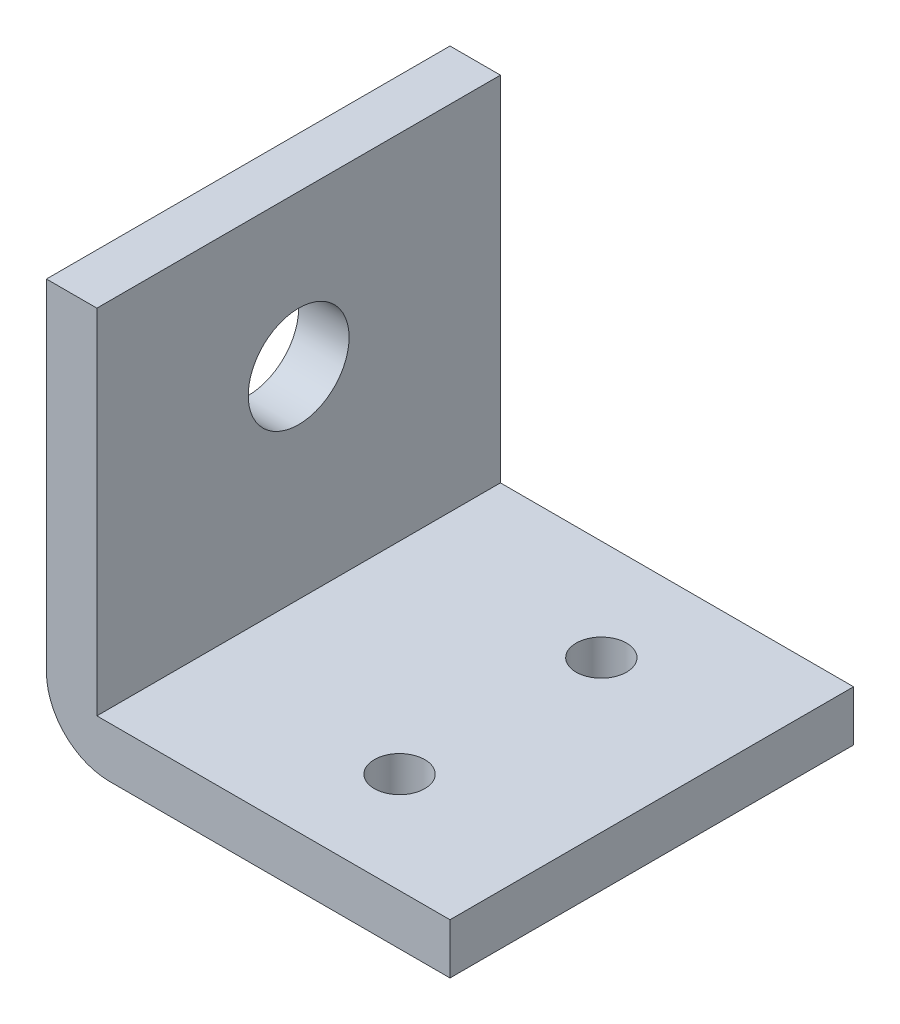
ISO-10303-21;
HEADER;
FILE_DESCRIPTION(('STEP AP214'),'2;1');
FILE_NAME('part.step','',(''),(''),'','','');
FILE_SCHEMA(('AUTOMOTIVE_DESIGN { 1 0 10303 214 1 1 1 1 }'));
ENDSEC;
DATA;
#1=APPLICATION_CONTEXT('core data for automotive mechanical design processes');
#2=APPLICATION_PROTOCOL_DEFINITION('international standard','automotive_design',2000,#1);
#3=PRODUCT_CONTEXT('',#1,'mechanical');
#4=PRODUCT('Part','Part','',(#3));
#5=PRODUCT_RELATED_PRODUCT_CATEGORY('part','',(#4));
#6=PRODUCT_DEFINITION_FORMATION('','',#4);
#7=PRODUCT_DEFINITION_CONTEXT('part definition',#1,'design');
#8=PRODUCT_DEFINITION('design','',#6,#7);
#9=PRODUCT_DEFINITION_SHAPE('','',#8);
#10=(LENGTH_UNIT() NAMED_UNIT(*) SI_UNIT(.MILLI.,.METRE.));
#11=(NAMED_UNIT(*) PLANE_ANGLE_UNIT() SI_UNIT($,.RADIAN.));
#12=(NAMED_UNIT(*) SI_UNIT($,.STERADIAN.) SOLID_ANGLE_UNIT());
#13=UNCERTAINTY_MEASURE_WITH_UNIT(LENGTH_MEASURE(1.E-05),#10,'distance_accuracy_value','');
#14=(GEOMETRIC_REPRESENTATION_CONTEXT(3) GLOBAL_UNCERTAINTY_ASSIGNED_CONTEXT((#13)) GLOBAL_UNIT_ASSIGNED_CONTEXT((#10,
#11,#12)) REPRESENTATION_CONTEXT('',''));
#15=CARTESIAN_POINT('',(0.,0.,0.));
#16=DIRECTION('',(0.,0.,1.));
#17=DIRECTION('',(1.,0.,0.));
#18=AXIS2_PLACEMENT_3D('',#15,#16,#17);
#19=CARTESIAN_POINT('',(0.,-5.,40.));
#20=DIRECTION('',(-1.,0.,0.));
#21=DIRECTION('',(0.,0.,1.));
#22=AXIS2_PLACEMENT_3D('',#19,#20,#21);
#23=PLANE('',#22);
#24=DIRECTION('',(0.,1.,0.));
#25=VECTOR('',#24,1.);
#26=CARTESIAN_POINT('',(0.,-5.,0.));
#27=LINE('',#26,#25);
#28=CARTESIAN_POINT('',(0.,-5.,0.));
#29=VERTEX_POINT('',#28);
#30=CARTESIAN_POINT('',(0.,0.,0.));
#31=VERTEX_POINT('',#30);
#32=EDGE_CURVE('E123',#29,#31,#27,.T.);
#33=ORIENTED_EDGE('',*,*,#32,.T.);
#34=DIRECTION('',(0.,0.,-1.));
#35=VECTOR('',#34,1.);
#36=CARTESIAN_POINT('',(0.,0.,40.));
#37=LINE('',#36,#35);
#38=CARTESIAN_POINT('',(0.,0.,40.));
#39=VERTEX_POINT('',#38);
#40=EDGE_CURVE('E11',#39,#31,#37,.T.);
#41=ORIENTED_EDGE('',*,*,#40,.F.);
#42=DIRECTION('',(0.,1.,0.));
#43=VECTOR('',#42,1.);
#44=CARTESIAN_POINT('',(0.,-5.,40.));
#45=LINE('',#44,#43);
#46=CARTESIAN_POINT('',(0.,-5.,40.));
#47=VERTEX_POINT('',#46);
#48=EDGE_CURVE('E136',#47,#39,#45,.T.);
#49=ORIENTED_EDGE('',*,*,#48,.F.);
#50=DIRECTION('',(0.,0.,-1.));
#51=VECTOR('',#50,1.);
#52=CARTESIAN_POINT('',(0.,-5.,40.));
#53=LINE('',#52,#51);
#54=EDGE_CURVE('E119',#47,#29,#53,.T.);
#55=ORIENTED_EDGE('',*,*,#54,.T.);
#56=EDGE_LOOP('',(#33,#41,#49,#55));
#57=FACE_BOUND('',#56,.T.);
#58=ADVANCED_FACE('F33',(#57),#23,.F.);
#59=CARTESIAN_POINT('',(-35.,0.,40.));
#60=DIRECTION('',(0.,-1.,0.));
#61=DIRECTION('',(0.,0.,-1.));
#62=AXIS2_PLACEMENT_3D('',#59,#60,#61);
#63=PLANE('',#62);
#64=CARTESIAN_POINT('',(-15.,0.,10.));
#65=DIRECTION('',(0.,1.,0.));
#66=DIRECTION('',(0.,0.,1.));
#67=AXIS2_PLACEMENT_3D('',#64,#65,#66);
#68=CIRCLE('',#67,2.5);
#69=CARTESIAN_POINT('',(-15.,0.,12.5));
#70=VERTEX_POINT('',#69);
#71=EDGE_CURVE('E171',#70,#70,#68,.T.);
#72=ORIENTED_EDGE('',*,*,#71,.F.);
#73=EDGE_LOOP('',(#72));
#74=FACE_BOUND('',#73,.T.);
#75=CARTESIAN_POINT('',(-15.,0.,30.));
#76=DIRECTION('',(0.,1.,0.));
#77=DIRECTION('',(0.,0.,1.));
#78=AXIS2_PLACEMENT_3D('',#75,#76,#77);
#79=CIRCLE('',#78,2.5);
#80=CARTESIAN_POINT('',(-15.,0.,32.5));
#81=VERTEX_POINT('',#80);
#82=EDGE_CURVE('E165',#81,#81,#79,.T.);
#83=ORIENTED_EDGE('',*,*,#82,.F.);
#84=EDGE_LOOP('',(#83));
#85=FACE_BOUND('',#84,.T.);
#86=DIRECTION('',(-1.,0.,0.));
#87=VECTOR('',#86,1.);
#88=CARTESIAN_POINT('',(-35.,0.,0.));
#89=LINE('',#88,#87);
#90=CARTESIAN_POINT('',(-35.,0.,0.));
#91=VERTEX_POINT('',#90);
#92=EDGE_CURVE('E126',#31,#91,#89,.T.);
#93=ORIENTED_EDGE('',*,*,#92,.T.);
#94=DIRECTION('',(0.,0.,-1.));
#95=VECTOR('',#94,1.);
#96=CARTESIAN_POINT('',(-35.,0.,40.));
#97=LINE('',#96,#95);
#98=CARTESIAN_POINT('',(-35.,0.,40.));
#99=VERTEX_POINT('',#98);
#100=EDGE_CURVE('E41',#99,#91,#97,.T.);
#101=ORIENTED_EDGE('',*,*,#100,.F.);
#102=DIRECTION('',(-1.,0.,0.));
#103=VECTOR('',#102,1.);
#104=CARTESIAN_POINT('',(-35.,0.,40.));
#105=LINE('',#104,#103);
#106=EDGE_CURVE('E89',#39,#99,#105,.T.);
#107=ORIENTED_EDGE('',*,*,#106,.F.);
#108=ORIENTED_EDGE('',*,*,#40,.T.);
#109=EDGE_LOOP('',(#93,#101,#107,#108));
#110=FACE_BOUND('',#109,.T.);
#111=ADVANCED_FACE('F187',(#74,#85,#110),#63,.F.);
#112=CARTESIAN_POINT('',(-35.,35.,40.));
#113=DIRECTION('',(-1.,0.,0.));
#114=DIRECTION('',(0.,0.,1.));
#115=AXIS2_PLACEMENT_3D('',#112,#113,#114);
#116=PLANE('',#115);
#117=CARTESIAN_POINT('',(-35.,20.,20.));
#118=DIRECTION('',(1.,0.,0.));
#119=DIRECTION('',(0.,0.,-1.));
#120=AXIS2_PLACEMENT_3D('',#117,#118,#119);
#121=CIRCLE('',#120,5.);
#122=CARTESIAN_POINT('',(-35.,20.,15.));
#123=VERTEX_POINT('',#122);
#124=EDGE_CURVE('E159',#123,#123,#121,.T.);
#125=ORIENTED_EDGE('',*,*,#124,.F.);
#126=EDGE_LOOP('',(#125));
#127=FACE_BOUND('',#126,.T.);
#128=DIRECTION('',(0.,1.,0.));
#129=VECTOR('',#128,1.);
#130=CARTESIAN_POINT('',(-35.,35.,0.));
#131=LINE('',#130,#129);
#132=CARTESIAN_POINT('',(-35.,35.,0.));
#133=VERTEX_POINT('',#132);
#134=EDGE_CURVE('E129',#91,#133,#131,.T.);
#135=ORIENTED_EDGE('',*,*,#134,.T.);
#136=DIRECTION('',(0.,0.,-1.));
#137=VECTOR('',#136,1.);
#138=CARTESIAN_POINT('',(-35.,35.,40.));
#139=LINE('',#138,#137);
#140=CARTESIAN_POINT('',(-35.,35.,40.));
#141=VERTEX_POINT('',#140);
#142=EDGE_CURVE('E140',#141,#133,#139,.T.);
#143=ORIENTED_EDGE('',*,*,#142,.F.);
#144=DIRECTION('',(0.,1.,0.));
#145=VECTOR('',#144,1.);
#146=CARTESIAN_POINT('',(-35.,35.,40.));
#147=LINE('',#146,#145);
#148=EDGE_CURVE('E148',#99,#141,#147,.T.);
#149=ORIENTED_EDGE('',*,*,#148,.F.);
#150=ORIENTED_EDGE('',*,*,#100,.T.);
#151=EDGE_LOOP('',(#135,#143,#149,#150));
#152=FACE_BOUND('',#151,.T.);
#153=ADVANCED_FACE('F146',(#127,#152),#116,.F.);
#154=CARTESIAN_POINT('',(-35.,35.,40.));
#155=DIRECTION('',(0.,-1.,0.));
#156=DIRECTION('',(0.,0.,-1.));
#157=AXIS2_PLACEMENT_3D('',#154,#155,#156);
#158=PLANE('',#157);
#159=DIRECTION('',(-1.,0.,0.));
#160=VECTOR('',#159,1.);
#161=CARTESIAN_POINT('',(-35.,35.,0.));
#162=LINE('',#161,#160);
#163=CARTESIAN_POINT('',(-40.,35.,0.));
#164=VERTEX_POINT('',#163);
#165=EDGE_CURVE('E131',#133,#164,#162,.T.);
#166=ORIENTED_EDGE('',*,*,#165,.T.);
#167=DIRECTION('',(0.,0.,-1.));
#168=VECTOR('',#167,1.);
#169=CARTESIAN_POINT('',(-40.,35.,40.));
#170=LINE('',#169,#168);
#171=CARTESIAN_POINT('',(-40.,35.,40.));
#172=VERTEX_POINT('',#171);
#173=EDGE_CURVE('E114',#172,#164,#170,.T.);
#174=ORIENTED_EDGE('',*,*,#173,.F.);
#175=DIRECTION('',(-1.,0.,0.));
#176=VECTOR('',#175,1.);
#177=CARTESIAN_POINT('',(-35.,35.,40.));
#178=LINE('',#177,#176);
#179=EDGE_CURVE('E105',#141,#172,#178,.T.);
#180=ORIENTED_EDGE('',*,*,#179,.F.);
#181=ORIENTED_EDGE('',*,*,#142,.T.);
#182=EDGE_LOOP('',(#166,#174,#180,#181));
#183=FACE_BOUND('',#182,.T.);
#184=ADVANCED_FACE('F154',(#183),#158,.F.);
#185=CARTESIAN_POINT('',(-40.,35.,40.));
#186=DIRECTION('',(1.,0.,0.));
#187=DIRECTION('',(0.,1.,0.));
#188=AXIS2_PLACEMENT_3D('',#185,#186,#187);
#189=PLANE('',#188);
#190=CARTESIAN_POINT('',(-40.,20.,20.));
#191=DIRECTION('',(1.,0.,0.));
#192=DIRECTION('',(0.,0.,-1.));
#193=AXIS2_PLACEMENT_3D('',#190,#191,#192);
#194=CIRCLE('',#193,5.);
#195=CARTESIAN_POINT('',(-40.,20.,15.));
#196=VERTEX_POINT('',#195);
#197=EDGE_CURVE('E127',#196,#196,#194,.T.);
#198=ORIENTED_EDGE('',*,*,#197,.T.);
#199=EDGE_LOOP('',(#198));
#200=FACE_BOUND('',#199,.T.);
#201=DIRECTION('',(0.,-1.,0.));
#202=VECTOR('',#201,1.);
#203=CARTESIAN_POINT('',(-40.,35.,0.));
#204=LINE('',#203,#202);
#205=CARTESIAN_POINT('',(-40.,1.25,0.));
#206=VERTEX_POINT('',#205);
#207=EDGE_CURVE('E113',#164,#206,#204,.T.);
#208=ORIENTED_EDGE('',*,*,#207,.T.);
#209=DIRECTION('',(0.,0.,-1.));
#210=VECTOR('',#209,1.);
#211=CARTESIAN_POINT('',(-40.,1.25,40.));
#212=LINE('',#211,#210);
#213=CARTESIAN_POINT('',(-40.,1.25,40.));
#214=VERTEX_POINT('',#213);
#215=EDGE_CURVE('E110',#214,#206,#212,.T.);
#216=ORIENTED_EDGE('',*,*,#215,.F.);
#217=DIRECTION('',(0.,-1.,0.));
#218=VECTOR('',#217,1.);
#219=CARTESIAN_POINT('',(-40.,35.,40.));
#220=LINE('',#219,#218);
#221=EDGE_CURVE('E99',#172,#214,#220,.T.);
#222=ORIENTED_EDGE('',*,*,#221,.F.);
#223=ORIENTED_EDGE('',*,*,#173,.T.);
#224=EDGE_LOOP('',(#208,#216,#222,#223));
#225=FACE_BOUND('',#224,.T.);
#226=ADVANCED_FACE('F111',(#200,#225),#189,.F.);
#227=CARTESIAN_POINT('',(-33.75,1.25,40.));
#228=DIRECTION('',(0.,0.,-1.));
#229=DIRECTION('',(-1.,0.,0.));
#230=AXIS2_PLACEMENT_3D('',#227,#228,#229);
#231=CYLINDRICAL_SURFACE('',#230,6.25);
#232=CARTESIAN_POINT('',(-33.75,1.25,0.));
#233=DIRECTION('',(0.,0.,1.));
#234=DIRECTION('',(1.,0.,0.));
#235=AXIS2_PLACEMENT_3D('',#232,#233,#234);
#236=CIRCLE('',#235,6.25);
#237=CARTESIAN_POINT('',(-33.75,-4.99999999999999,0.));
#238=VERTEX_POINT('',#237);
#239=EDGE_CURVE('E75',#206,#238,#236,.T.);
#240=ORIENTED_EDGE('',*,*,#239,.T.);
#241=DIRECTION('',(0.,0.,-1.));
#242=VECTOR('',#241,1.);
#243=CARTESIAN_POINT('',(-33.75,-4.99999999999999,40.));
#244=LINE('',#243,#242);
#245=CARTESIAN_POINT('',(-33.75,-4.99999999999999,40.));
#246=VERTEX_POINT('',#245);
#247=EDGE_CURVE('E115',#246,#238,#244,.T.);
#248=ORIENTED_EDGE('',*,*,#247,.F.);
#249=CARTESIAN_POINT('',(-33.75,1.25,40.));
#250=DIRECTION('',(0.,0.,1.));
#251=DIRECTION('',(1.,0.,0.));
#252=AXIS2_PLACEMENT_3D('',#249,#250,#251);
#253=CIRCLE('',#252,6.25);
#254=EDGE_CURVE('E103',#214,#246,#253,.T.);
#255=ORIENTED_EDGE('',*,*,#254,.F.);
#256=ORIENTED_EDGE('',*,*,#215,.T.);
#257=EDGE_LOOP('',(#240,#248,#255,#256));
#258=FACE_BOUND('',#257,.T.);
#259=ADVANCED_FACE('F117',(#258),#231,.T.);
#260=CARTESIAN_POINT('',(-33.75,-5.,40.));
#261=DIRECTION('',(0.,1.,0.));
#262=DIRECTION('',(-1.,0.,0.));
#263=AXIS2_PLACEMENT_3D('',#260,#261,#262);
#264=PLANE('',#263);
#265=CARTESIAN_POINT('',(-15.,-5.,10.));
#266=DIRECTION('',(0.,1.,0.));
#267=DIRECTION('',(0.,0.,1.));
#268=AXIS2_PLACEMENT_3D('',#265,#266,#267);
#269=CIRCLE('',#268,2.5);
#270=CARTESIAN_POINT('',(-15.,-5.,12.5));
#271=VERTEX_POINT('',#270);
#272=EDGE_CURVE('E162',#271,#271,#269,.T.);
#273=ORIENTED_EDGE('',*,*,#272,.T.);
#274=EDGE_LOOP('',(#273));
#275=FACE_BOUND('',#274,.T.);
#276=CARTESIAN_POINT('',(-15.,-5.,30.));
#277=DIRECTION('',(0.,1.,0.));
#278=DIRECTION('',(0.,0.,1.));
#279=AXIS2_PLACEMENT_3D('',#276,#277,#278);
#280=CIRCLE('',#279,2.5);
#281=CARTESIAN_POINT('',(-15.,-5.,32.5));
#282=VERTEX_POINT('',#281);
#283=EDGE_CURVE('E168',#282,#282,#280,.T.);
#284=ORIENTED_EDGE('',*,*,#283,.T.);
#285=EDGE_LOOP('',(#284));
#286=FACE_BOUND('',#285,.T.);
#287=DIRECTION('',(1.,0.,0.));
#288=VECTOR('',#287,1.);
#289=CARTESIAN_POINT('',(-33.75,-5.,0.));
#290=LINE('',#289,#288);
#291=EDGE_CURVE('E81',#238,#29,#290,.T.);
#292=ORIENTED_EDGE('',*,*,#291,.T.);
#293=ORIENTED_EDGE('',*,*,#54,.F.);
#294=DIRECTION('',(1.,0.,0.));
#295=VECTOR('',#294,1.);
#296=CARTESIAN_POINT('',(-33.75,-5.,40.));
#297=LINE('',#296,#295);
#298=EDGE_CURVE('E49',#246,#47,#297,.T.);
#299=ORIENTED_EDGE('',*,*,#298,.F.);
#300=ORIENTED_EDGE('',*,*,#247,.T.);
#301=EDGE_LOOP('',(#292,#293,#299,#300));
#302=FACE_BOUND('',#301,.T.);
#303=ADVANCED_FACE('F177',(#275,#286,#302),#264,.F.);
#304=CARTESIAN_POINT('',(-33.75,1.25,40.));
#305=DIRECTION('',(0.,0.,1.));
#306=DIRECTION('',(1.,0.,0.));
#307=AXIS2_PLACEMENT_3D('',#304,#305,#306);
#308=PLANE('',#307);
#309=ORIENTED_EDGE('',*,*,#48,.T.);
#310=ORIENTED_EDGE('',*,*,#106,.T.);
#311=ORIENTED_EDGE('',*,*,#148,.T.);
#312=ORIENTED_EDGE('',*,*,#179,.T.);
#313=ORIENTED_EDGE('',*,*,#221,.T.);
#314=ORIENTED_EDGE('',*,*,#254,.T.);
#315=ORIENTED_EDGE('',*,*,#298,.T.);
#316=EDGE_LOOP('',(#309,#310,#311,#312,#313,#314,#315));
#317=FACE_BOUND('',#316,.T.);
#318=ADVANCED_FACE('F101',(#317),#308,.T.);
#319=CARTESIAN_POINT('',(-33.75,1.25,0.));
#320=DIRECTION('',(0.,0.,1.));
#321=DIRECTION('',(1.,0.,0.));
#322=AXIS2_PLACEMENT_3D('',#319,#320,#321);
#323=PLANE('',#322);
#324=ORIENTED_EDGE('',*,*,#32,.F.);
#325=ORIENTED_EDGE('',*,*,#291,.F.);
#326=ORIENTED_EDGE('',*,*,#239,.F.);
#327=ORIENTED_EDGE('',*,*,#207,.F.);
#328=ORIENTED_EDGE('',*,*,#165,.F.);
#329=ORIENTED_EDGE('',*,*,#134,.F.);
#330=ORIENTED_EDGE('',*,*,#92,.F.);
#331=EDGE_LOOP('',(#324,#325,#326,#327,#328,#329,#330));
#332=FACE_BOUND('',#331,.T.);
#333=ADVANCED_FACE('F152',(#332),#323,.F.);
#334=CARTESIAN_POINT('',(-40.,20.,20.));
#335=DIRECTION('',(1.,0.,0.));
#336=DIRECTION('',(0.,0.,-1.));
#337=AXIS2_PLACEMENT_3D('',#334,#335,#336);
#338=CYLINDRICAL_SURFACE('',#337,5.);
#339=CARTESIAN_POINT('',(-40.,20.,15.));
#340=CARTESIAN_POINT('',(-39.9479166666667,20.,15.));
#341=CARTESIAN_POINT('',(-39.8958333333333,20.,15.));
#342=CARTESIAN_POINT('',(-39.7916666666667,20.,15.));
#343=CARTESIAN_POINT('',(-39.7395833333333,20.,15.));
#344=CARTESIAN_POINT('',(-39.6354166666667,20.,15.));
#345=CARTESIAN_POINT('',(-39.5833333333333,20.,15.));
#346=CARTESIAN_POINT('',(-39.4791666666667,20.,15.));
#347=CARTESIAN_POINT('',(-39.4270833333333,20.,15.));
#348=CARTESIAN_POINT('',(-39.3229166666667,20.,15.));
#349=CARTESIAN_POINT('',(-39.2708333333333,20.,15.));
#350=CARTESIAN_POINT('',(-39.1666666666667,20.,15.));
#351=CARTESIAN_POINT('',(-39.1145833333333,20.,15.));
#352=CARTESIAN_POINT('',(-39.0104166666667,20.,15.));
#353=CARTESIAN_POINT('',(-38.9583333333333,20.,15.));
#354=CARTESIAN_POINT('',(-38.8541666666667,20.,15.));
#355=CARTESIAN_POINT('',(-38.8020833333333,20.,15.));
#356=CARTESIAN_POINT('',(-38.6979166666667,20.,15.));
#357=CARTESIAN_POINT('',(-38.6458333333333,20.,15.));
#358=CARTESIAN_POINT('',(-38.5416666666667,20.,15.));
#359=CARTESIAN_POINT('',(-38.4895833333333,20.,15.));
#360=CARTESIAN_POINT('',(-38.3854166666667,20.,15.));
#361=CARTESIAN_POINT('',(-38.3333333333333,20.,15.));
#362=CARTESIAN_POINT('',(-38.2291666666667,20.,15.));
#363=CARTESIAN_POINT('',(-38.1770833333333,20.,15.));
#364=CARTESIAN_POINT('',(-38.0729166666667,20.,15.));
#365=CARTESIAN_POINT('',(-38.0208333333333,20.,15.));
#366=CARTESIAN_POINT('',(-37.9166666666667,20.,15.));
#367=CARTESIAN_POINT('',(-37.8645833333333,20.,15.));
#368=CARTESIAN_POINT('',(-37.7604166666667,20.,15.));
#369=CARTESIAN_POINT('',(-37.7083333333333,20.,15.));
#370=CARTESIAN_POINT('',(-37.6041666666667,20.,15.));
#371=CARTESIAN_POINT('',(-37.5520833333333,20.,15.));
#372=CARTESIAN_POINT('',(-37.4479166666667,20.,15.));
#373=CARTESIAN_POINT('',(-37.3958333333333,20.,15.));
#374=CARTESIAN_POINT('',(-37.2916666666667,20.,15.));
#375=CARTESIAN_POINT('',(-37.2395833333333,20.,15.));
#376=CARTESIAN_POINT('',(-37.1354166666667,20.,15.));
#377=CARTESIAN_POINT('',(-37.0833333333333,20.,15.));
#378=CARTESIAN_POINT('',(-36.9791666666667,20.,15.));
#379=CARTESIAN_POINT('',(-36.9270833333333,20.,15.));
#380=CARTESIAN_POINT('',(-36.8229166666667,20.,15.));
#381=CARTESIAN_POINT('',(-36.7708333333333,20.,15.));
#382=CARTESIAN_POINT('',(-36.6666666666667,20.,15.));
#383=CARTESIAN_POINT('',(-36.6145833333333,20.,15.));
#384=CARTESIAN_POINT('',(-36.5104166666667,20.,15.));
#385=CARTESIAN_POINT('',(-36.4583333333333,20.,15.));
#386=CARTESIAN_POINT('',(-36.3541666666667,20.,15.));
#387=CARTESIAN_POINT('',(-36.3020833333333,20.,15.));
#388=CARTESIAN_POINT('',(-36.1979166666667,20.,15.));
#389=CARTESIAN_POINT('',(-36.1458333333333,20.,15.));
#390=CARTESIAN_POINT('',(-36.0416666666667,20.,15.));
#391=CARTESIAN_POINT('',(-35.9895833333333,20.,15.));
#392=CARTESIAN_POINT('',(-35.8854166666667,20.,15.));
#393=CARTESIAN_POINT('',(-35.8333333333333,20.,15.));
#394=CARTESIAN_POINT('',(-35.7291666666667,20.,15.));
#395=CARTESIAN_POINT('',(-35.6770833333333,20.,15.));
#396=CARTESIAN_POINT('',(-35.5729166666667,20.,15.));
#397=CARTESIAN_POINT('',(-35.5208333333333,20.,15.));
#398=CARTESIAN_POINT('',(-35.4166666666666,20.,15.));
#399=CARTESIAN_POINT('',(-35.3645833333333,20.,15.));
#400=CARTESIAN_POINT('',(-35.2604166666667,20.,15.));
#401=CARTESIAN_POINT('',(-35.2083333333333,20.,15.));
#402=CARTESIAN_POINT('',(-35.1041666666666,20.,15.));
#403=CARTESIAN_POINT('',(-35.0520833333333,20.,15.));
#404=CARTESIAN_POINT('',(-35.,20.,15.));
#405=B_SPLINE_CURVE_WITH_KNOTS('',3,(#339,#340,#341,#342,#343,#344,#345,#346,#347,#348,#349,
#350,#351,#352,#353,#354,#355,#356,#357,#358,#359,#360,#361,#362,#363,#364,#365,#366,#367,#368,
#369,#370,#371,#372,#373,#374,#375,#376,#377,#378,#379,#380,#381,#382,#383,#384,#385,#386,#387,
#388,#389,#390,#391,#392,#393,#394,#395,#396,#397,#398,#399,#400,#401,#402,#403,#404),
.UNSPECIFIED.,.F.,.F.,(4,2,2,2,2,2,2,2,2,2,2,2,2,2,2,2,2,2,2,2,2,2,2,2,2,2,2,2,2,2,2,2,4),(0.,
0.156249999999997,0.3125,0.468749999999997,0.625000000000001,0.781249999999997,
0.937500000000001,1.09375,1.25,1.40625,1.5625,1.71875,1.87500000000001,2.03125000000001,
2.18750000000001,2.34375000000001,2.50000000000001,2.65625000000001,2.81250000000001,
2.96875000000001,3.12500000000001,3.28125000000001,3.43750000000002,3.59375000000001,
3.75000000000002,3.90625000000001,4.06250000000002,4.21875000000001,4.37500000000002,
4.53125000000002,4.68750000000002,4.84375000000002,5.00000000000002),.UNSPECIFIED.);
#406=EDGE_CURVE('BSEAM250',#196,#123,#405,.T.);
#407=ORIENTED_EDGE('',*,*,#197,.F.);
#408=ORIENTED_EDGE('',*,*,#124,.T.);
#409=ORIENTED_EDGE('',*,*,#406,.T.);
#410=ORIENTED_EDGE('',*,*,#406,.F.);
#411=EDGE_LOOP('',(#407,#409,#408,#410));
#412=FACE_BOUND('',#411,.T.);
#413=ADVANCED_FACE('F250',(#412),#338,.F.);
#414=CARTESIAN_POINT('',(-15.,-5.,30.));
#415=DIRECTION('',(0.,1.,0.));
#416=DIRECTION('',(0.,0.,1.));
#417=AXIS2_PLACEMENT_3D('',#414,#415,#416);
#418=CYLINDRICAL_SURFACE('',#417,2.5);
#419=ORIENTED_EDGE('',*,*,#283,.F.);
#420=EDGE_LOOP('',(#419));
#421=FACE_BOUND('',#420,.T.);
#422=ORIENTED_EDGE('',*,*,#82,.T.);
#423=EDGE_LOOP('',(#422));
#424=FACE_BOUND('',#423,.T.);
#425=ADVANCED_FACE('F183',(#421,#424),#418,.F.);
#426=CARTESIAN_POINT('',(-15.,-5.,10.));
#427=DIRECTION('',(0.,1.,0.));
#428=DIRECTION('',(0.,0.,1.));
#429=AXIS2_PLACEMENT_3D('',#426,#427,#428);
#430=CYLINDRICAL_SURFACE('',#429,2.5);
#431=ORIENTED_EDGE('',*,*,#272,.F.);
#432=EDGE_LOOP('',(#431));
#433=FACE_BOUND('',#432,.T.);
#434=ORIENTED_EDGE('',*,*,#71,.T.);
#435=EDGE_LOOP('',(#434));
#436=FACE_BOUND('',#435,.T.);
#437=ADVANCED_FACE('F180',(#433,#436),#430,.F.);
#438=CLOSED_SHELL('',(#58,#111,#153,#184,#226,#259,#303,#318,#333,#413,#425,#437));
#439=MANIFOLD_SOLID_BREP('B2',#438);
#440=ADVANCED_BREP_SHAPE_REPRESENTATION('',(#18,#439),#14);
#441=SHAPE_DEFINITION_REPRESENTATION(#9,#440);
ENDSEC;
END-ISO-10303-21;
